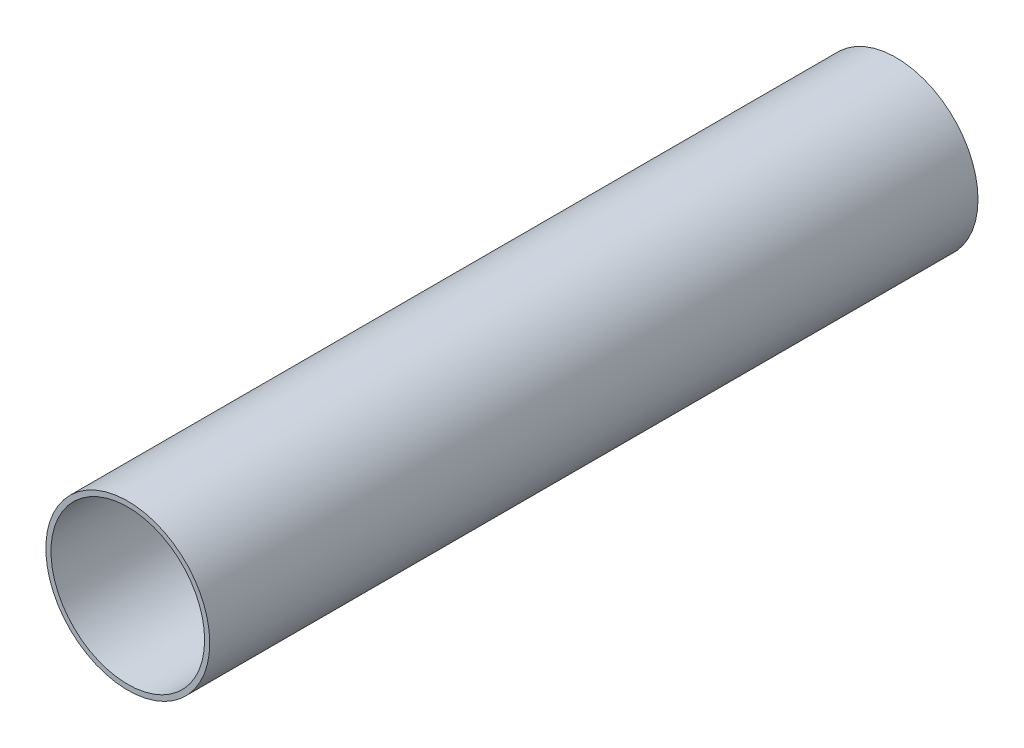
ISO-10303-21;
HEADER;
FILE_DESCRIPTION(('STEP AP214'),'2;1');
FILE_NAME('part.step','',(''),(''),'','','');
FILE_SCHEMA(('AUTOMOTIVE_DESIGN { 1 0 10303 214 1 1 1 1 }'));
ENDSEC;
DATA;
#1=APPLICATION_CONTEXT('core data for automotive mechanical design processes');
#2=APPLICATION_PROTOCOL_DEFINITION('international standard','automotive_design',2000,#1);
#3=PRODUCT_CONTEXT('',#1,'mechanical');
#4=PRODUCT('Part','Part','',(#3));
#5=PRODUCT_RELATED_PRODUCT_CATEGORY('part','',(#4));
#6=PRODUCT_DEFINITION_FORMATION('','',#4);
#7=PRODUCT_DEFINITION_CONTEXT('part definition',#1,'design');
#8=PRODUCT_DEFINITION('design','',#6,#7);
#9=PRODUCT_DEFINITION_SHAPE('','',#8);
#10=(LENGTH_UNIT() NAMED_UNIT(*) SI_UNIT(.MILLI.,.METRE.));
#11=(NAMED_UNIT(*) PLANE_ANGLE_UNIT() SI_UNIT($,.RADIAN.));
#12=(NAMED_UNIT(*) SI_UNIT($,.STERADIAN.) SOLID_ANGLE_UNIT());
#13=UNCERTAINTY_MEASURE_WITH_UNIT(LENGTH_MEASURE(1.E-05),#10,'distance_accuracy_value','');
#14=(GEOMETRIC_REPRESENTATION_CONTEXT(3) GLOBAL_UNCERTAINTY_ASSIGNED_CONTEXT((#13)) GLOBAL_UNIT_ASSIGNED_CONTEXT((#10,
#11,#12)) REPRESENTATION_CONTEXT('',''));
#15=CARTESIAN_POINT('',(0.,0.,0.));
#16=DIRECTION('',(0.,0.,1.));
#17=DIRECTION('',(1.,0.,0.));
#18=AXIS2_PLACEMENT_3D('',#15,#16,#17);
#19=CARTESIAN_POINT('',(0.,0.,190.5));
#20=DIRECTION('',(0.,0.,1.));
#21=DIRECTION('',(1.,0.,0.));
#22=AXIS2_PLACEMENT_3D('',#19,#20,#21);
#23=PLANE('',#22);
#24=CARTESIAN_POINT('',(0.,0.,190.5));
#25=DIRECTION('',(0.,0.,1.));
#26=DIRECTION('',(1.,0.,0.));
#27=AXIS2_PLACEMENT_3D('',#24,#25,#26);
#28=CIRCLE('',#27,20.32);
#29=CARTESIAN_POINT('',(20.32,0.,190.5));
#30=VERTEX_POINT('',#29);
#31=EDGE_CURVE('E11',#30,#30,#28,.T.);
#32=ORIENTED_EDGE('',*,*,#31,.T.);
#33=EDGE_LOOP('',(#32));
#34=FACE_BOUND('',#33,.T.);
#35=CARTESIAN_POINT('',(0.,0.,190.5));
#36=DIRECTION('',(0.,0.,1.));
#37=DIRECTION('',(1.,0.,0.));
#38=AXIS2_PLACEMENT_3D('',#35,#36,#37);
#39=CIRCLE('',#38,19.05);
#40=CARTESIAN_POINT('',(19.05,0.,190.5));
#41=VERTEX_POINT('',#40);
#42=EDGE_CURVE('E56',#41,#41,#39,.T.);
#43=ORIENTED_EDGE('',*,*,#42,.F.);
#44=EDGE_LOOP('',(#43));
#45=FACE_BOUND('',#44,.T.);
#46=ADVANCED_FACE('F43',(#34,#45),#23,.T.);
#47=CARTESIAN_POINT('',(0.,0.,0.));
#48=DIRECTION('',(0.,0.,1.));
#49=DIRECTION('',(1.,0.,0.));
#50=AXIS2_PLACEMENT_3D('',#47,#48,#49);
#51=PLANE('',#50);
#52=CARTESIAN_POINT('',(0.,0.,0.));
#53=DIRECTION('',(0.,0.,1.));
#54=DIRECTION('',(1.,0.,0.));
#55=AXIS2_PLACEMENT_3D('',#52,#53,#54);
#56=CIRCLE('',#55,20.32);
#57=CARTESIAN_POINT('',(20.32,0.,0.));
#58=VERTEX_POINT('',#57);
#59=EDGE_CURVE('E47',#58,#58,#56,.T.);
#60=ORIENTED_EDGE('',*,*,#59,.F.);
#61=EDGE_LOOP('',(#60));
#62=FACE_BOUND('',#61,.T.);
#63=CARTESIAN_POINT('',(0.,0.,0.));
#64=DIRECTION('',(0.,0.,1.));
#65=DIRECTION('',(1.,0.,0.));
#66=AXIS2_PLACEMENT_3D('',#63,#64,#65);
#67=CIRCLE('',#66,19.05);
#68=CARTESIAN_POINT('',(19.05,0.,0.));
#69=VERTEX_POINT('',#68);
#70=EDGE_CURVE('E58',#69,#69,#67,.T.);
#71=ORIENTED_EDGE('',*,*,#70,.T.);
#72=EDGE_LOOP('',(#71));
#73=FACE_BOUND('',#72,.T.);
#74=ADVANCED_FACE('F70',(#62,#73),#51,.F.);
#75=CARTESIAN_POINT('',(0.,0.,190.5));
#76=DIRECTION('',(0.,0.,-1.));
#77=DIRECTION('',(-1.,0.,0.));
#78=AXIS2_PLACEMENT_3D('',#75,#76,#77);
#79=CYLINDRICAL_SURFACE('',#78,20.32);
#80=ORIENTED_EDGE('',*,*,#31,.F.);
#81=EDGE_LOOP('',(#80));
#82=FACE_BOUND('',#81,.T.);
#83=ORIENTED_EDGE('',*,*,#59,.T.);
#84=EDGE_LOOP('',(#83));
#85=FACE_BOUND('',#84,.T.);
#86=ADVANCED_FACE('F45',(#82,#85),#79,.T.);
#87=CARTESIAN_POINT('',(0.,0.,190.5));
#88=DIRECTION('',(0.,0.,-1.));
#89=DIRECTION('',(-1.,0.,0.));
#90=AXIS2_PLACEMENT_3D('',#87,#88,#89);
#91=CYLINDRICAL_SURFACE('',#90,19.05);
#92=ORIENTED_EDGE('',*,*,#42,.T.);
#93=EDGE_LOOP('',(#92));
#94=FACE_BOUND('',#93,.T.);
#95=ORIENTED_EDGE('',*,*,#70,.F.);
#96=EDGE_LOOP('',(#95));
#97=FACE_BOUND('',#96,.T.);
#98=ADVANCED_FACE('F66',(#94,#97),#91,.F.);
#99=CLOSED_SHELL('',(#46,#74,#86,#98));
#100=MANIFOLD_SOLID_BREP('B2',#99);
#101=ADVANCED_BREP_SHAPE_REPRESENTATION('',(#18,#100),#14);
#102=SHAPE_DEFINITION_REPRESENTATION(#9,#101);
ENDSEC;
END-ISO-10303-21;
